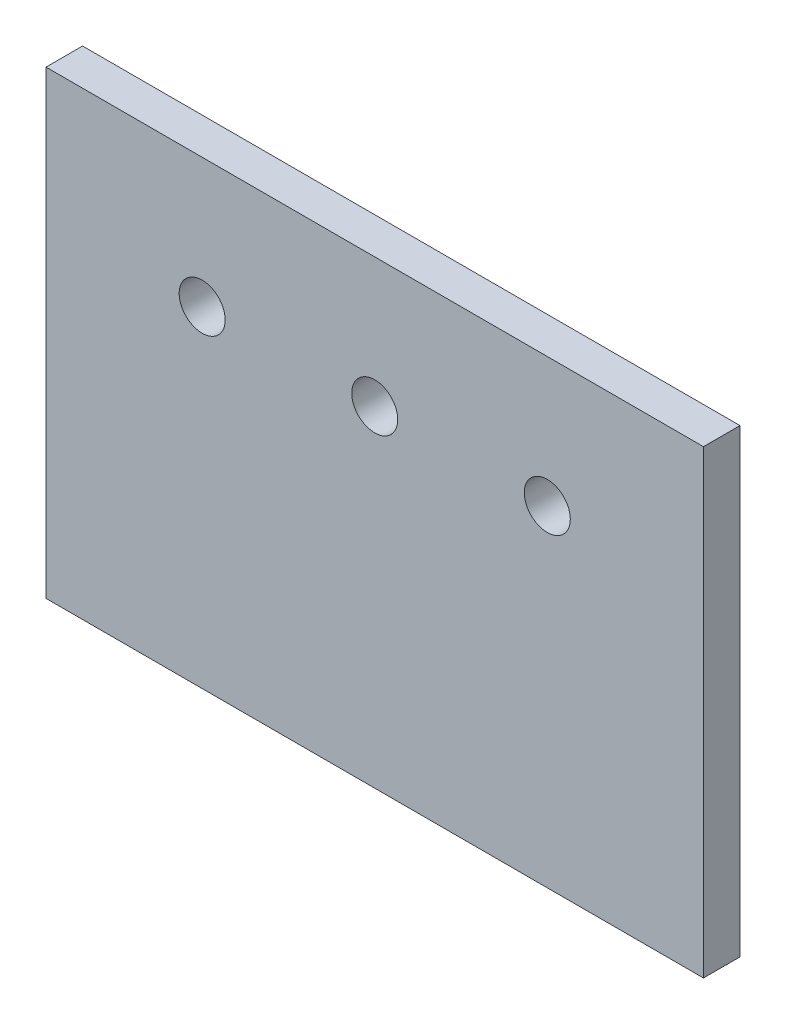
ISO-10303-21;
HEADER;
FILE_DESCRIPTION(('STEP AP214'),'2;1');
FILE_NAME('part.step','',(''),(''),'','','');
FILE_SCHEMA(('AUTOMOTIVE_DESIGN { 1 0 10303 214 1 1 1 1 }'));
ENDSEC;
DATA;
#1=APPLICATION_CONTEXT('core data for automotive mechanical design processes');
#2=APPLICATION_PROTOCOL_DEFINITION('international standard','automotive_design',2000,#1);
#3=PRODUCT_CONTEXT('',#1,'mechanical');
#4=PRODUCT('Part','Part','',(#3));
#5=PRODUCT_RELATED_PRODUCT_CATEGORY('part','',(#4));
#6=PRODUCT_DEFINITION_FORMATION('','',#4);
#7=PRODUCT_DEFINITION_CONTEXT('part definition',#1,'design');
#8=PRODUCT_DEFINITION('design','',#6,#7);
#9=PRODUCT_DEFINITION_SHAPE('','',#8);
#10=(LENGTH_UNIT() NAMED_UNIT(*) SI_UNIT(.MILLI.,.METRE.));
#11=(NAMED_UNIT(*) PLANE_ANGLE_UNIT() SI_UNIT($,.RADIAN.));
#12=(NAMED_UNIT(*) SI_UNIT($,.STERADIAN.) SOLID_ANGLE_UNIT());
#13=UNCERTAINTY_MEASURE_WITH_UNIT(LENGTH_MEASURE(1.E-05),#10,'distance_accuracy_value','');
#14=(GEOMETRIC_REPRESENTATION_CONTEXT(3) GLOBAL_UNCERTAINTY_ASSIGNED_CONTEXT((#13)) GLOBAL_UNIT_ASSIGNED_CONTEXT((#10,
#11,#12)) REPRESENTATION_CONTEXT('',''));
#15=CARTESIAN_POINT('',(0.,0.,0.));
#16=DIRECTION('',(0.,0.,1.));
#17=DIRECTION('',(1.,0.,0.));
#18=AXIS2_PLACEMENT_3D('',#15,#16,#17);
#19=CARTESIAN_POINT('',(0.,0.,6.35));
#20=DIRECTION('',(0.,0.,1.));
#21=DIRECTION('',(1.,0.,0.));
#22=AXIS2_PLACEMENT_3D('',#19,#20,#21);
#23=PLANE('',#22);
#24=CARTESIAN_POINT('',(27.15,-22.5,6.35));
#25=DIRECTION('',(0.,0.,1.));
#26=DIRECTION('',(1.,0.,0.));
#27=AXIS2_PLACEMENT_3D('',#24,#25,#26);
#28=CIRCLE('',#27,4.);
#29=CARTESIAN_POINT('',(31.15,-22.5,6.35));
#30=VERTEX_POINT('',#29);
#31=EDGE_CURVE('E115',#30,#30,#28,.T.);
#32=ORIENTED_EDGE('',*,*,#31,.F.);
#33=EDGE_LOOP('',(#32));
#34=FACE_BOUND('',#33,.T.);
#35=DIRECTION('',(0.,-1.,0.));
#36=VECTOR('',#35,1.);
#37=CARTESIAN_POINT('',(0.,0.,6.35));
#38=LINE('',#37,#36);
#39=CARTESIAN_POINT('',(0.,0.,6.35));
#40=VERTEX_POINT('',#39);
#41=CARTESIAN_POINT('',(0.,-80.,6.35));
#42=VERTEX_POINT('',#41);
#43=EDGE_CURVE('E85',#40,#42,#38,.T.);
#44=ORIENTED_EDGE('',*,*,#43,.T.);
#45=DIRECTION('',(1.,0.,0.));
#46=VECTOR('',#45,1.);
#47=CARTESIAN_POINT('',(0.,-80.,6.35));
#48=LINE('',#47,#46);
#49=CARTESIAN_POINT('',(114.3,-80.,6.35));
#50=VERTEX_POINT('',#49);
#51=EDGE_CURVE('E80',#42,#50,#48,.T.);
#52=ORIENTED_EDGE('',*,*,#51,.T.);
#53=DIRECTION('',(0.,1.,0.));
#54=VECTOR('',#53,1.);
#55=CARTESIAN_POINT('',(114.3,0.,6.35));
#56=LINE('',#55,#54);
#57=CARTESIAN_POINT('',(114.3,0.,6.35));
#58=VERTEX_POINT('',#57);
#59=EDGE_CURVE('E83',#50,#58,#56,.T.);
#60=ORIENTED_EDGE('',*,*,#59,.T.);
#61=DIRECTION('',(-1.,0.,0.));
#62=VECTOR('',#61,1.);
#63=CARTESIAN_POINT('',(0.,0.,6.35));
#64=LINE('',#63,#62);
#65=EDGE_CURVE('E50',#58,#40,#64,.T.);
#66=ORIENTED_EDGE('',*,*,#65,.T.);
#67=EDGE_LOOP('',(#44,#52,#60,#66));
#68=FACE_BOUND('',#67,.T.);
#69=CARTESIAN_POINT('',(57.15,-22.5,6.35));
#70=DIRECTION('',(0.,0.,1.));
#71=DIRECTION('',(1.,0.,0.));
#72=AXIS2_PLACEMENT_3D('',#69,#70,#71);
#73=CIRCLE('',#72,3.99999999999999);
#74=CARTESIAN_POINT('',(61.15,-22.5,6.35));
#75=VERTEX_POINT('',#74);
#76=EDGE_CURVE('E100',#75,#75,#73,.T.);
#77=ORIENTED_EDGE('',*,*,#76,.F.);
#78=EDGE_LOOP('',(#77));
#79=FACE_BOUND('',#78,.T.);
#80=CARTESIAN_POINT('',(87.15,-22.5,6.35));
#81=DIRECTION('',(0.,0.,1.));
#82=DIRECTION('',(1.,0.,0.));
#83=AXIS2_PLACEMENT_3D('',#80,#81,#82);
#84=CIRCLE('',#83,3.99999999999999);
#85=CARTESIAN_POINT('',(91.15,-22.5,6.35));
#86=VERTEX_POINT('',#85);
#87=EDGE_CURVE('E121',#86,#86,#84,.T.);
#88=ORIENTED_EDGE('',*,*,#87,.F.);
#89=EDGE_LOOP('',(#88));
#90=FACE_BOUND('',#89,.T.);
#91=ADVANCED_FACE('F33',(#34,#68,#79,#90),#23,.T.);
#92=CARTESIAN_POINT('',(0.,0.,0.));
#93=DIRECTION('',(0.,0.,1.));
#94=DIRECTION('',(1.,0.,0.));
#95=AXIS2_PLACEMENT_3D('',#92,#93,#94);
#96=PLANE('',#95);
#97=DIRECTION('',(0.,-1.,0.));
#98=VECTOR('',#97,1.);
#99=CARTESIAN_POINT('',(0.,0.,0.));
#100=LINE('',#99,#98);
#101=CARTESIAN_POINT('',(0.,0.,0.));
#102=VERTEX_POINT('',#101);
#103=CARTESIAN_POINT('',(0.,-80.,0.));
#104=VERTEX_POINT('',#103);
#105=EDGE_CURVE('E97',#102,#104,#100,.T.);
#106=ORIENTED_EDGE('',*,*,#105,.F.);
#107=DIRECTION('',(-1.,0.,0.));
#108=VECTOR('',#107,1.);
#109=CARTESIAN_POINT('',(0.,0.,0.));
#110=LINE('',#109,#108);
#111=CARTESIAN_POINT('',(114.3,0.,0.));
#112=VERTEX_POINT('',#111);
#113=EDGE_CURVE('E73',#112,#102,#110,.T.);
#114=ORIENTED_EDGE('',*,*,#113,.F.);
#115=DIRECTION('',(0.,1.,0.));
#116=VECTOR('',#115,1.);
#117=CARTESIAN_POINT('',(114.3,0.,0.));
#118=LINE('',#117,#116);
#119=CARTESIAN_POINT('',(114.3,-80.,0.));
#120=VERTEX_POINT('',#119);
#121=EDGE_CURVE('E67',#120,#112,#118,.T.);
#122=ORIENTED_EDGE('',*,*,#121,.F.);
#123=DIRECTION('',(1.,0.,0.));
#124=VECTOR('',#123,1.);
#125=CARTESIAN_POINT('',(0.,-80.,0.));
#126=LINE('',#125,#124);
#127=EDGE_CURVE('E89',#104,#120,#126,.T.);
#128=ORIENTED_EDGE('',*,*,#127,.F.);
#129=EDGE_LOOP('',(#106,#114,#122,#128));
#130=FACE_BOUND('',#129,.T.);
#131=CARTESIAN_POINT('',(57.15,-22.5,0.));
#132=DIRECTION('',(0.,0.,1.));
#133=DIRECTION('',(1.,0.,0.));
#134=AXIS2_PLACEMENT_3D('',#131,#132,#133);
#135=CIRCLE('',#134,3.99999999999999);
#136=CARTESIAN_POINT('',(61.15,-22.5,0.));
#137=VERTEX_POINT('',#136);
#138=EDGE_CURVE('E112',#137,#137,#135,.T.);
#139=ORIENTED_EDGE('',*,*,#138,.T.);
#140=EDGE_LOOP('',(#139));
#141=FACE_BOUND('',#140,.T.);
#142=CARTESIAN_POINT('',(27.15,-22.5,0.));
#143=DIRECTION('',(0.,0.,1.));
#144=DIRECTION('',(1.,0.,0.));
#145=AXIS2_PLACEMENT_3D('',#142,#143,#144);
#146=CIRCLE('',#145,4.);
#147=CARTESIAN_POINT('',(31.15,-22.5,0.));
#148=VERTEX_POINT('',#147);
#149=EDGE_CURVE('E118',#148,#148,#146,.T.);
#150=ORIENTED_EDGE('',*,*,#149,.T.);
#151=EDGE_LOOP('',(#150));
#152=FACE_BOUND('',#151,.T.);
#153=CARTESIAN_POINT('',(87.15,-22.5,0.));
#154=DIRECTION('',(0.,0.,1.));
#155=DIRECTION('',(1.,0.,0.));
#156=AXIS2_PLACEMENT_3D('',#153,#154,#155);
#157=CIRCLE('',#156,3.99999999999999);
#158=CARTESIAN_POINT('',(91.15,-22.5,0.));
#159=VERTEX_POINT('',#158);
#160=EDGE_CURVE('E124',#159,#159,#157,.T.);
#161=ORIENTED_EDGE('',*,*,#160,.T.);
#162=EDGE_LOOP('',(#161));
#163=FACE_BOUND('',#162,.T.);
#164=ADVANCED_FACE('F108',(#130,#141,#152,#163),#96,.F.);
#165=CARTESIAN_POINT('',(0.,0.,6.35));
#166=DIRECTION('',(1.,0.,0.));
#167=DIRECTION('',(0.,0.,-1.));
#168=AXIS2_PLACEMENT_3D('',#165,#166,#167);
#169=PLANE('',#168);
#170=ORIENTED_EDGE('',*,*,#105,.T.);
#171=DIRECTION('',(0.,0.,-1.));
#172=VECTOR('',#171,1.);
#173=CARTESIAN_POINT('',(0.,-80.,6.35));
#174=LINE('',#173,#172);
#175=EDGE_CURVE('E11',#42,#104,#174,.T.);
#176=ORIENTED_EDGE('',*,*,#175,.F.);
#177=ORIENTED_EDGE('',*,*,#43,.F.);
#178=DIRECTION('',(0.,0.,-1.));
#179=VECTOR('',#178,1.);
#180=CARTESIAN_POINT('',(0.,0.,6.35));
#181=LINE('',#180,#179);
#182=EDGE_CURVE('E93',#40,#102,#181,.T.);
#183=ORIENTED_EDGE('',*,*,#182,.T.);
#184=EDGE_LOOP('',(#170,#176,#177,#183));
#185=FACE_BOUND('',#184,.T.);
#186=ADVANCED_FACE('F35',(#185),#169,.F.);
#187=CARTESIAN_POINT('',(0.,-80.,6.35));
#188=DIRECTION('',(0.,1.,0.));
#189=DIRECTION('',(0.,0.,1.));
#190=AXIS2_PLACEMENT_3D('',#187,#188,#189);
#191=PLANE('',#190);
#192=ORIENTED_EDGE('',*,*,#127,.T.);
#193=DIRECTION('',(0.,0.,-1.));
#194=VECTOR('',#193,1.);
#195=CARTESIAN_POINT('',(114.3,-80.,6.35));
#196=LINE('',#195,#194);
#197=EDGE_CURVE('E42',#50,#120,#196,.T.);
#198=ORIENTED_EDGE('',*,*,#197,.F.);
#199=ORIENTED_EDGE('',*,*,#51,.F.);
#200=ORIENTED_EDGE('',*,*,#175,.T.);
#201=EDGE_LOOP('',(#192,#198,#199,#200));
#202=FACE_BOUND('',#201,.T.);
#203=ADVANCED_FACE('F88',(#202),#191,.F.);
#204=CARTESIAN_POINT('',(114.3,0.,6.35));
#205=DIRECTION('',(-1.,0.,0.));
#206=DIRECTION('',(0.,-1.,0.));
#207=AXIS2_PLACEMENT_3D('',#204,#205,#206);
#208=PLANE('',#207);
#209=ORIENTED_EDGE('',*,*,#121,.T.);
#210=DIRECTION('',(0.,0.,-1.));
#211=VECTOR('',#210,1.);
#212=CARTESIAN_POINT('',(114.3,0.,6.35));
#213=LINE('',#212,#211);
#214=EDGE_CURVE('E90',#58,#112,#213,.T.);
#215=ORIENTED_EDGE('',*,*,#214,.F.);
#216=ORIENTED_EDGE('',*,*,#59,.F.);
#217=ORIENTED_EDGE('',*,*,#197,.T.);
#218=EDGE_LOOP('',(#209,#215,#216,#217));
#219=FACE_BOUND('',#218,.T.);
#220=ADVANCED_FACE('F91',(#219),#208,.F.);
#221=CARTESIAN_POINT('',(0.,0.,6.35));
#222=DIRECTION('',(0.,-1.,0.));
#223=DIRECTION('',(0.,0.,-1.));
#224=AXIS2_PLACEMENT_3D('',#221,#222,#223);
#225=PLANE('',#224);
#226=ORIENTED_EDGE('',*,*,#113,.T.);
#227=ORIENTED_EDGE('',*,*,#182,.F.);
#228=ORIENTED_EDGE('',*,*,#65,.F.);
#229=ORIENTED_EDGE('',*,*,#214,.T.);
#230=EDGE_LOOP('',(#226,#227,#228,#229));
#231=FACE_BOUND('',#230,.T.);
#232=ADVANCED_FACE('F105',(#231),#225,.F.);
#233=CARTESIAN_POINT('',(57.15,-22.5,6.35));
#234=DIRECTION('',(0.,0.,-1.));
#235=DIRECTION('',(-1.,0.,0.));
#236=AXIS2_PLACEMENT_3D('',#233,#234,#235);
#237=CYLINDRICAL_SURFACE('',#236,3.99999999999999);
#238=ORIENTED_EDGE('',*,*,#76,.T.);
#239=EDGE_LOOP('',(#238));
#240=FACE_BOUND('',#239,.T.);
#241=ORIENTED_EDGE('',*,*,#138,.F.);
#242=EDGE_LOOP('',(#241));
#243=FACE_BOUND('',#242,.T.);
#244=ADVANCED_FACE('F142',(#240,#243),#237,.F.);
#245=CARTESIAN_POINT('',(27.15,-22.5,6.35));
#246=DIRECTION('',(0.,0.,-1.));
#247=DIRECTION('',(-1.,0.,0.));
#248=AXIS2_PLACEMENT_3D('',#245,#246,#247);
#249=CYLINDRICAL_SURFACE('',#248,4.);
#250=ORIENTED_EDGE('',*,*,#31,.T.);
#251=EDGE_LOOP('',(#250));
#252=FACE_BOUND('',#251,.T.);
#253=ORIENTED_EDGE('',*,*,#149,.F.);
#254=EDGE_LOOP('',(#253));
#255=FACE_BOUND('',#254,.T.);
#256=ADVANCED_FACE('F188',(#252,#255),#249,.F.);
#257=CARTESIAN_POINT('',(87.15,-22.5,6.35));
#258=DIRECTION('',(0.,0.,-1.));
#259=DIRECTION('',(-1.,0.,0.));
#260=AXIS2_PLACEMENT_3D('',#257,#258,#259);
#261=CYLINDRICAL_SURFACE('',#260,3.99999999999999);
#262=ORIENTED_EDGE('',*,*,#87,.T.);
#263=EDGE_LOOP('',(#262));
#264=FACE_BOUND('',#263,.T.);
#265=ORIENTED_EDGE('',*,*,#160,.F.);
#266=EDGE_LOOP('',(#265));
#267=FACE_BOUND('',#266,.T.);
#268=ADVANCED_FACE('F130',(#264,#267),#261,.F.);
#269=CLOSED_SHELL('',(#91,#164,#186,#203,#220,#232,#244,#256,#268));
#270=MANIFOLD_SOLID_BREP('B2',#269);
#271=ADVANCED_BREP_SHAPE_REPRESENTATION('',(#18,#270),#14);
#272=SHAPE_DEFINITION_REPRESENTATION(#9,#271);
ENDSEC;
END-ISO-10303-21;
